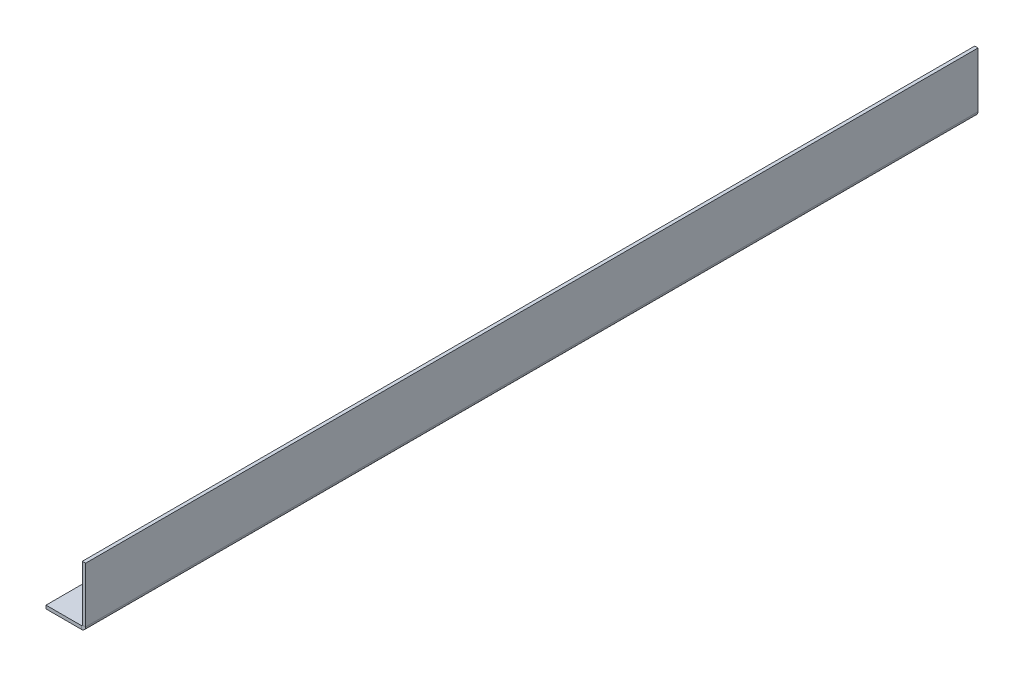
ISO-10303-21;
HEADER;
FILE_DESCRIPTION(('STEP AP214'),'2;1');
FILE_NAME('part.step','',(''),(''),'','','');
FILE_SCHEMA(('AUTOMOTIVE_DESIGN { 1 0 10303 214 1 1 1 1 }'));
ENDSEC;
DATA;
#1=APPLICATION_CONTEXT('core data for automotive mechanical design processes');
#2=APPLICATION_PROTOCOL_DEFINITION('international standard','automotive_design',2000,#1);
#3=PRODUCT_CONTEXT('',#1,'mechanical');
#4=PRODUCT('Part','Part','',(#3));
#5=PRODUCT_RELATED_PRODUCT_CATEGORY('part','',(#4));
#6=PRODUCT_DEFINITION_FORMATION('','',#4);
#7=PRODUCT_DEFINITION_CONTEXT('part definition',#1,'design');
#8=PRODUCT_DEFINITION('design','',#6,#7);
#9=PRODUCT_DEFINITION_SHAPE('','',#8);
#10=(LENGTH_UNIT() NAMED_UNIT(*) SI_UNIT(.MILLI.,.METRE.));
#11=(NAMED_UNIT(*) PLANE_ANGLE_UNIT() SI_UNIT($,.RADIAN.));
#12=(NAMED_UNIT(*) SI_UNIT($,.STERADIAN.) SOLID_ANGLE_UNIT());
#13=UNCERTAINTY_MEASURE_WITH_UNIT(LENGTH_MEASURE(1.E-05),#10,'distance_accuracy_value','');
#14=(GEOMETRIC_REPRESENTATION_CONTEXT(3) GLOBAL_UNCERTAINTY_ASSIGNED_CONTEXT((#13)) GLOBAL_UNIT_ASSIGNED_CONTEXT((#10,
#11,#12)) REPRESENTATION_CONTEXT('',''));
#15=CARTESIAN_POINT('',(0.,0.,0.));
#16=DIRECTION('',(0.,0.,1.));
#17=DIRECTION('',(1.,0.,0.));
#18=AXIS2_PLACEMENT_3D('',#15,#16,#17);
#19=CARTESIAN_POINT('',(-15.,9.99999999999995,-37.5));
#20=DIRECTION('',(0.,-1.,0.));
#21=DIRECTION('',(1.,0.,0.));
#22=AXIS2_PLACEMENT_3D('',#19,#20,#21);
#23=CYLINDRICAL_SURFACE('',#22,5.);
#24=CARTESIAN_POINT('',(-15.,0.,-37.5));
#25=DIRECTION('',(0.,-1.,0.));
#26=DIRECTION('',(1.,0.,0.));
#27=AXIS2_PLACEMENT_3D('',#24,#25,#26);
#28=CIRCLE('',#27,5.);
#29=CARTESIAN_POINT('',(-9.99999999999999,0.,-37.5));
#30=VERTEX_POINT('',#29);
#31=EDGE_CURVE('E77',#30,#30,#28,.T.);
#32=ORIENTED_EDGE('',*,*,#31,.T.);
#33=EDGE_LOOP('',(#32));
#34=FACE_BOUND('',#33,.T.);
#35=CARTESIAN_POINT('',(-15.,2.49999999999996,-37.5));
#36=DIRECTION('',(0.,-1.,0.));
#37=DIRECTION('',(1.,0.,0.));
#38=AXIS2_PLACEMENT_3D('',#35,#36,#37);
#39=CIRCLE('',#38,5.);
#40=CARTESIAN_POINT('',(-10.,2.49999999999998,-37.5));
#41=VERTEX_POINT('',#40);
#42=EDGE_CURVE('E15',#41,#41,#39,.T.);
#43=ORIENTED_EDGE('',*,*,#42,.F.);
#44=EDGE_LOOP('',(#43));
#45=FACE_BOUND('',#44,.T.);
#46=ADVANCED_FACE('F70',(#34,#45),#23,.F.);
#47=CARTESIAN_POINT('',(-15.,9.99999999999995,-237.5));
#48=DIRECTION('',(0.,-1.,0.));
#49=DIRECTION('',(1.,0.,0.));
#50=AXIS2_PLACEMENT_3D('',#47,#48,#49);
#51=CYLINDRICAL_SURFACE('',#50,5.);
#52=CARTESIAN_POINT('',(-15.,0.,-237.5));
#53=DIRECTION('',(0.,-1.,0.));
#54=DIRECTION('',(1.,0.,0.));
#55=AXIS2_PLACEMENT_3D('',#52,#53,#54);
#56=CIRCLE('',#55,5.);
#57=CARTESIAN_POINT('',(-9.99999999999999,0.,-237.5));
#58=VERTEX_POINT('',#57);
#59=EDGE_CURVE('E221',#58,#58,#56,.T.);
#60=ORIENTED_EDGE('',*,*,#59,.T.);
#61=EDGE_LOOP('',(#60));
#62=FACE_BOUND('',#61,.T.);
#63=CARTESIAN_POINT('',(-15.,2.49999999999996,-237.5));
#64=DIRECTION('',(0.,-1.,0.));
#65=DIRECTION('',(1.,0.,0.));
#66=AXIS2_PLACEMENT_3D('',#63,#64,#65);
#67=CIRCLE('',#66,5.);
#68=CARTESIAN_POINT('',(-10.,2.49999999999998,-237.5));
#69=VERTEX_POINT('',#68);
#70=EDGE_CURVE('E229',#69,#69,#67,.T.);
#71=ORIENTED_EDGE('',*,*,#70,.F.);
#72=EDGE_LOOP('',(#71));
#73=FACE_BOUND('',#72,.T.);
#74=ADVANCED_FACE('F254',(#62,#73),#51,.F.);
#75=CARTESIAN_POINT('',(-2.5,0.,0.));
#76=DIRECTION('',(0.,0.,1.));
#77=DIRECTION('',(1.,0.,0.));
#78=AXIS2_PLACEMENT_3D('',#75,#76,#77);
#79=PLANE('',#78);
#80=DIRECTION('',(0.,-1.,0.));
#81=VECTOR('',#80,1.);
#82=CARTESIAN_POINT('',(-2.5,0.,0.));
#83=LINE('',#82,#81);
#84=CARTESIAN_POINT('',(-2.5,45.,0.));
#85=VERTEX_POINT('',#84);
#86=CARTESIAN_POINT('',(-2.5,3.2366,0.));
#87=VERTEX_POINT('',#86);
#88=EDGE_CURVE('E204',#85,#87,#83,.T.);
#89=ORIENTED_EDGE('',*,*,#88,.T.);
#90=DIRECTION('',(1.,0.,0.));
#91=VECTOR('',#90,1.);
#92=CARTESIAN_POINT('',(-2.5,3.2366,0.));
#93=LINE('',#92,#91);
#94=CARTESIAN_POINT('',(0.,3.2366,0.));
#95=VERTEX_POINT('',#94);
#96=EDGE_CURVE('E195',#87,#95,#93,.T.);
#97=ORIENTED_EDGE('',*,*,#96,.T.);
#98=DIRECTION('',(0.,-1.,0.));
#99=VECTOR('',#98,1.);
#100=CARTESIAN_POINT('',(0.,0.,0.));
#101=LINE('',#100,#99);
#102=CARTESIAN_POINT('',(0.,45.,0.));
#103=VERTEX_POINT('',#102);
#104=EDGE_CURVE('E202',#103,#95,#101,.T.);
#105=ORIENTED_EDGE('',*,*,#104,.F.);
#106=DIRECTION('',(1.,0.,0.));
#107=VECTOR('',#106,1.);
#108=CARTESIAN_POINT('',(-2.5,45.,0.));
#109=LINE('',#108,#107);
#110=EDGE_CURVE('E219',#85,#103,#109,.T.);
#111=ORIENTED_EDGE('',*,*,#110,.F.);
#112=EDGE_LOOP('',(#89,#97,#105,#111));
#113=FACE_BOUND('',#112,.T.);
#114=ADVANCED_FACE('F258',(#113),#79,.T.);
#115=CARTESIAN_POINT('',(-2.5,0.,0.));
#116=DIRECTION('',(-1.,0.,0.));
#117=DIRECTION('',(0.,0.,1.));
#118=AXIS2_PLACEMENT_3D('',#115,#116,#117);
#119=PLANE('',#118);
#120=DIRECTION('',(0.,1.,0.));
#121=VECTOR('',#120,1.);
#122=CARTESIAN_POINT('',(-2.5,0.,-675.));
#123=LINE('',#122,#121);
#124=CARTESIAN_POINT('',(-2.5,3.2366,-675.));
#125=VERTEX_POINT('',#124);
#126=CARTESIAN_POINT('',(-2.5,45.,-675.));
#127=VERTEX_POINT('',#126);
#128=EDGE_CURVE('E206',#125,#127,#123,.T.);
#129=ORIENTED_EDGE('',*,*,#128,.F.);
#130=DIRECTION('',(0.,0.,1.));
#131=VECTOR('',#130,1.);
#132=CARTESIAN_POINT('',(-2.5,3.2366,0.));
#133=LINE('',#132,#131);
#134=EDGE_CURVE('E91',#87,#125,#133,.F.);
#135=ORIENTED_EDGE('',*,*,#134,.F.);
#136=ORIENTED_EDGE('',*,*,#88,.F.);
#137=DIRECTION('',(0.,0.,1.));
#138=VECTOR('',#137,1.);
#139=CARTESIAN_POINT('',(-2.5,45.,0.));
#140=LINE('',#139,#138);
#141=EDGE_CURVE('E209',#127,#85,#140,.T.);
#142=ORIENTED_EDGE('',*,*,#141,.F.);
#143=EDGE_LOOP('',(#129,#135,#136,#142));
#144=FACE_BOUND('',#143,.T.);
#145=ADVANCED_FACE('F263',(#144),#119,.T.);
#146=CARTESIAN_POINT('',(0.,0.,0.));
#147=DIRECTION('',(-1.,0.,0.));
#148=DIRECTION('',(0.,0.,1.));
#149=AXIS2_PLACEMENT_3D('',#146,#147,#148);
#150=PLANE('',#149);
#151=DIRECTION('',(0.,0.,1.));
#152=VECTOR('',#151,1.);
#153=CARTESIAN_POINT('',(0.,3.2366,0.));
#154=LINE('',#153,#152);
#155=CARTESIAN_POINT('',(0.,3.2366,-675.));
#156=VERTEX_POINT('',#155);
#157=EDGE_CURVE('E143',#95,#156,#154,.F.);
#158=ORIENTED_EDGE('',*,*,#157,.T.);
#159=DIRECTION('',(0.,1.,0.));
#160=VECTOR('',#159,1.);
#161=CARTESIAN_POINT('',(0.,0.,-675.));
#162=LINE('',#161,#160);
#163=CARTESIAN_POINT('',(0.,45.,-675.));
#164=VERTEX_POINT('',#163);
#165=EDGE_CURVE('E215',#156,#164,#162,.T.);
#166=ORIENTED_EDGE('',*,*,#165,.T.);
#167=DIRECTION('',(0.,0.,1.));
#168=VECTOR('',#167,1.);
#169=CARTESIAN_POINT('',(0.,45.,0.));
#170=LINE('',#169,#168);
#171=EDGE_CURVE('E207',#164,#103,#170,.T.);
#172=ORIENTED_EDGE('',*,*,#171,.T.);
#173=ORIENTED_EDGE('',*,*,#104,.T.);
#174=EDGE_LOOP('',(#158,#166,#172,#173));
#175=FACE_BOUND('',#174,.T.);
#176=ADVANCED_FACE('F275',(#175),#150,.F.);
#177=CARTESIAN_POINT('',(-2.5,45.,0.));
#178=DIRECTION('',(0.,1.,0.));
#179=DIRECTION('',(0.,0.,1.));
#180=AXIS2_PLACEMENT_3D('',#177,#178,#179);
#181=PLANE('',#180);
#182=ORIENTED_EDGE('',*,*,#171,.F.);
#183=DIRECTION('',(1.,0.,0.));
#184=VECTOR('',#183,1.);
#185=CARTESIAN_POINT('',(-2.5,45.,-675.));
#186=LINE('',#185,#184);
#187=EDGE_CURVE('E212',#127,#164,#186,.T.);
#188=ORIENTED_EDGE('',*,*,#187,.F.);
#189=ORIENTED_EDGE('',*,*,#141,.T.);
#190=ORIENTED_EDGE('',*,*,#110,.T.);
#191=EDGE_LOOP('',(#182,#188,#189,#190));
#192=FACE_BOUND('',#191,.T.);
#193=ADVANCED_FACE('F272',(#192),#181,.T.);
#194=CARTESIAN_POINT('',(-2.5,0.,-675.));
#195=DIRECTION('',(0.,0.,-1.));
#196=DIRECTION('',(-1.,0.,0.));
#197=AXIS2_PLACEMENT_3D('',#194,#195,#196);
#198=PLANE('',#197);
#199=DIRECTION('',(1.,0.,0.));
#200=VECTOR('',#199,1.);
#201=CARTESIAN_POINT('',(-2.5,3.2366,-675.));
#202=LINE('',#201,#200);
#203=EDGE_CURVE('E84',#125,#156,#202,.T.);
#204=ORIENTED_EDGE('',*,*,#203,.F.);
#205=ORIENTED_EDGE('',*,*,#128,.T.);
#206=ORIENTED_EDGE('',*,*,#187,.T.);
#207=ORIENTED_EDGE('',*,*,#165,.F.);
#208=EDGE_LOOP('',(#204,#205,#206,#207));
#209=FACE_BOUND('',#208,.T.);
#210=ADVANCED_FACE('F268',(#209),#198,.T.);
#211=CARTESIAN_POINT('',(-3.2366,3.2366,-675.));
#212=DIRECTION('',(0.,0.,-1.));
#213=DIRECTION('',(-1.,0.,0.));
#214=AXIS2_PLACEMENT_3D('',#211,#212,#213);
#215=PLANE('',#214);
#216=DIRECTION('',(0.,-1.,0.));
#217=VECTOR('',#216,1.);
#218=CARTESIAN_POINT('',(-3.23659999999999,0.,-675.));
#219=LINE('',#218,#217);
#220=CARTESIAN_POINT('',(-3.2366,2.5,-675.));
#221=VERTEX_POINT('',#220);
#222=CARTESIAN_POINT('',(-3.23659999999999,0.,-675.));
#223=VERTEX_POINT('',#222);
#224=EDGE_CURVE('E189',#221,#223,#219,.T.);
#225=ORIENTED_EDGE('',*,*,#224,.F.);
#226=CARTESIAN_POINT('',(-3.2366,3.2366,-675.));
#227=DIRECTION('',(0.,0.,1.));
#228=DIRECTION('',(1.,0.,0.));
#229=AXIS2_PLACEMENT_3D('',#226,#227,#228);
#230=CIRCLE('',#229,0.7366);
#231=EDGE_CURVE('E146',#125,#221,#230,.F.);
#232=ORIENTED_EDGE('',*,*,#231,.F.);
#233=ORIENTED_EDGE('',*,*,#203,.T.);
#234=CARTESIAN_POINT('',(-3.2366,3.2366,-675.));
#235=DIRECTION('',(0.,0.,1.));
#236=DIRECTION('',(1.,0.,0.));
#237=AXIS2_PLACEMENT_3D('',#234,#235,#236);
#238=CIRCLE('',#237,3.2366);
#239=EDGE_CURVE('E194',#156,#223,#238,.F.);
#240=ORIENTED_EDGE('',*,*,#239,.T.);
#241=EDGE_LOOP('',(#225,#232,#233,#240));
#242=FACE_BOUND('',#241,.T.);
#243=ADVANCED_FACE('F271',(#242),#215,.T.);
#244=CARTESIAN_POINT('',(-3.2366,3.2366,0.));
#245=DIRECTION('',(0.,0.,-1.));
#246=DIRECTION('',(-1.,0.,0.));
#247=AXIS2_PLACEMENT_3D('',#244,#245,#246);
#248=PLANE('',#247);
#249=CARTESIAN_POINT('',(-3.2366,3.2366,0.));
#250=DIRECTION('',(0.,0.,1.));
#251=DIRECTION('',(1.,0.,0.));
#252=AXIS2_PLACEMENT_3D('',#249,#250,#251);
#253=CIRCLE('',#252,0.7366);
#254=CARTESIAN_POINT('',(-3.2366,2.5,0.));
#255=VERTEX_POINT('',#254);
#256=EDGE_CURVE('E153',#255,#87,#253,.T.);
#257=ORIENTED_EDGE('',*,*,#256,.F.);
#258=DIRECTION('',(0.,-1.,0.));
#259=VECTOR('',#258,1.);
#260=CARTESIAN_POINT('',(-3.2366,2.5,0.));
#261=LINE('',#260,#259);
#262=CARTESIAN_POINT('',(-3.23659999999999,0.,0.));
#263=VERTEX_POINT('',#262);
#264=EDGE_CURVE('E150',#255,#263,#261,.T.);
#265=ORIENTED_EDGE('',*,*,#264,.T.);
#266=CARTESIAN_POINT('',(-3.2366,3.2366,0.));
#267=DIRECTION('',(0.,0.,1.));
#268=DIRECTION('',(1.,0.,0.));
#269=AXIS2_PLACEMENT_3D('',#266,#267,#268);
#270=CIRCLE('',#269,3.2366);
#271=EDGE_CURVE('E136',#263,#95,#270,.T.);
#272=ORIENTED_EDGE('',*,*,#271,.T.);
#273=ORIENTED_EDGE('',*,*,#96,.F.);
#274=EDGE_LOOP('',(#257,#265,#272,#273));
#275=FACE_BOUND('',#274,.T.);
#276=ADVANCED_FACE('F151',(#275),#248,.F.);
#277=CARTESIAN_POINT('',(-3.2366,3.2366,0.));
#278=DIRECTION('',(0.,0.,1.));
#279=DIRECTION('',(0.,-1.,0.));
#280=AXIS2_PLACEMENT_3D('',#277,#278,#279);
#281=CYLINDRICAL_SURFACE('',#280,3.2366);
#282=ORIENTED_EDGE('',*,*,#157,.F.);
#283=ORIENTED_EDGE('',*,*,#271,.F.);
#284=DIRECTION('',(0.,0.,1.));
#285=VECTOR('',#284,1.);
#286=CARTESIAN_POINT('',(-3.23659999999999,0.,0.));
#287=LINE('',#286,#285);
#288=EDGE_CURVE('E141',#223,#263,#287,.T.);
#289=ORIENTED_EDGE('',*,*,#288,.F.);
#290=ORIENTED_EDGE('',*,*,#239,.F.);
#291=EDGE_LOOP('',(#282,#283,#289,#290));
#292=FACE_BOUND('',#291,.T.);
#293=ADVANCED_FACE('F138',(#292),#281,.T.);
#294=CARTESIAN_POINT('',(-3.2366,3.2366,0.));
#295=DIRECTION('',(0.,0.,1.));
#296=DIRECTION('',(0.,-1.,0.));
#297=AXIS2_PLACEMENT_3D('',#294,#295,#296);
#298=CYLINDRICAL_SURFACE('',#297,0.7366);
#299=ORIENTED_EDGE('',*,*,#134,.T.);
#300=ORIENTED_EDGE('',*,*,#231,.T.);
#301=DIRECTION('',(0.,0.,-1.));
#302=VECTOR('',#301,1.);
#303=CARTESIAN_POINT('',(-3.2366,2.5,-675.));
#304=LINE('',#303,#302);
#305=EDGE_CURVE('E158',#221,#255,#304,.F.);
#306=ORIENTED_EDGE('',*,*,#305,.T.);
#307=ORIENTED_EDGE('',*,*,#256,.T.);
#308=EDGE_LOOP('',(#299,#300,#306,#307));
#309=FACE_BOUND('',#308,.T.);
#310=ADVANCED_FACE('F287',(#309),#298,.F.);
#311=CARTESIAN_POINT('',(-2.49999999999999,0.,0.));
#312=DIRECTION('',(0.,0.,1.));
#313=DIRECTION('',(1.,0.,0.));
#314=AXIS2_PLACEMENT_3D('',#311,#312,#313);
#315=PLANE('',#314);
#316=DIRECTION('',(1.,0.,0.));
#317=VECTOR('',#316,1.);
#318=CARTESIAN_POINT('',(-2.49999999999999,0.,0.));
#319=LINE('',#318,#317);
#320=CARTESIAN_POINT('',(-30.,0.,0.));
#321=VERTEX_POINT('',#320);
#322=EDGE_CURVE('E166',#321,#263,#319,.T.);
#323=ORIENTED_EDGE('',*,*,#322,.T.);
#324=ORIENTED_EDGE('',*,*,#264,.F.);
#325=DIRECTION('',(-1.,0.,0.));
#326=VECTOR('',#325,1.);
#327=CARTESIAN_POINT('',(0.,2.50000000000001,0.));
#328=LINE('',#327,#326);
#329=CARTESIAN_POINT('',(-30.,2.4999999999999,0.));
#330=VERTEX_POINT('',#329);
#331=EDGE_CURVE('E182',#330,#255,#328,.F.);
#332=ORIENTED_EDGE('',*,*,#331,.F.);
#333=DIRECTION('',(0.,1.,0.));
#334=VECTOR('',#333,1.);
#335=CARTESIAN_POINT('',(-30.,0.,0.));
#336=LINE('',#335,#334);
#337=EDGE_CURVE('E171',#321,#330,#336,.T.);
#338=ORIENTED_EDGE('',*,*,#337,.F.);
#339=EDGE_LOOP('',(#323,#324,#332,#338));
#340=FACE_BOUND('',#339,.T.);
#341=ADVANCED_FACE('F170',(#340),#315,.T.);
#342=CARTESIAN_POINT('',(-30.,0.,-675.));
#343=DIRECTION('',(0.,0.,-1.));
#344=DIRECTION('',(-1.,0.,0.));
#345=AXIS2_PLACEMENT_3D('',#342,#343,#344);
#346=PLANE('',#345);
#347=DIRECTION('',(1.,0.,0.));
#348=VECTOR('',#347,1.);
#349=CARTESIAN_POINT('',(0.,2.50000000000001,-675.));
#350=LINE('',#349,#348);
#351=CARTESIAN_POINT('',(-30.,2.4999999999999,-675.));
#352=VERTEX_POINT('',#351);
#353=EDGE_CURVE('E168',#221,#352,#350,.F.);
#354=ORIENTED_EDGE('',*,*,#353,.F.);
#355=ORIENTED_EDGE('',*,*,#224,.T.);
#356=DIRECTION('',(-1.,0.,0.));
#357=VECTOR('',#356,1.);
#358=CARTESIAN_POINT('',(-30.,0.,-675.));
#359=LINE('',#358,#357);
#360=CARTESIAN_POINT('',(-30.,0.,-675.));
#361=VERTEX_POINT('',#360);
#362=EDGE_CURVE('E167',#223,#361,#359,.T.);
#363=ORIENTED_EDGE('',*,*,#362,.T.);
#364=DIRECTION('',(0.,1.,0.));
#365=VECTOR('',#364,1.);
#366=CARTESIAN_POINT('',(-30.,0.,-675.));
#367=LINE('',#366,#365);
#368=EDGE_CURVE('E173',#361,#352,#367,.T.);
#369=ORIENTED_EDGE('',*,*,#368,.T.);
#370=EDGE_LOOP('',(#354,#355,#363,#369));
#371=FACE_BOUND('',#370,.T.);
#372=ADVANCED_FACE('F238',(#371),#346,.T.);
#373=CARTESIAN_POINT('',(0.,0.,0.));
#374=DIRECTION('',(0.,-1.,0.));
#375=DIRECTION('',(1.,0.,0.));
#376=AXIS2_PLACEMENT_3D('',#373,#374,#375);
#377=PLANE('',#376);
#378=CARTESIAN_POINT('',(-15.,0.,-437.5));
#379=DIRECTION('',(0.,-1.,0.));
#380=DIRECTION('',(1.,0.,0.));
#381=AXIS2_PLACEMENT_3D('',#378,#379,#380);
#382=CIRCLE('',#381,5.);
#383=CARTESIAN_POINT('',(-9.99999999999999,0.,-437.5));
#384=VERTEX_POINT('',#383);
#385=EDGE_CURVE('E444',#384,#384,#382,.T.);
#386=ORIENTED_EDGE('',*,*,#385,.F.);
#387=EDGE_LOOP('',(#386));
#388=FACE_BOUND('',#387,.T.);
#389=CARTESIAN_POINT('',(-15.,0.,-637.5));
#390=DIRECTION('',(0.,-1.,0.));
#391=DIRECTION('',(1.,0.,0.));
#392=AXIS2_PLACEMENT_3D('',#389,#390,#391);
#393=CIRCLE('',#392,5.);
#394=CARTESIAN_POINT('',(-9.99999999999999,0.,-637.5));
#395=VERTEX_POINT('',#394);
#396=EDGE_CURVE('E226',#395,#395,#393,.T.);
#397=ORIENTED_EDGE('',*,*,#396,.F.);
#398=EDGE_LOOP('',(#397));
#399=FACE_BOUND('',#398,.T.);
#400=ORIENTED_EDGE('',*,*,#362,.F.);
#401=ORIENTED_EDGE('',*,*,#288,.T.);
#402=ORIENTED_EDGE('',*,*,#322,.F.);
#403=DIRECTION('',(0.,0.,1.));
#404=VECTOR('',#403,1.);
#405=CARTESIAN_POINT('',(-30.,0.,0.));
#406=LINE('',#405,#404);
#407=EDGE_CURVE('E174',#361,#321,#406,.T.);
#408=ORIENTED_EDGE('',*,*,#407,.F.);
#409=EDGE_LOOP('',(#400,#401,#402,#408));
#410=FACE_BOUND('',#409,.T.);
#411=ORIENTED_EDGE('',*,*,#59,.F.);
#412=EDGE_LOOP('',(#411));
#413=FACE_BOUND('',#412,.T.);
#414=ORIENTED_EDGE('',*,*,#31,.F.);
#415=EDGE_LOOP('',(#414));
#416=FACE_BOUND('',#415,.T.);
#417=ADVANCED_FACE('F163',(#388,#399,#410,#413,#416),#377,.T.);
#418=CARTESIAN_POINT('',(0.,2.50000000000001,0.));
#419=DIRECTION('',(0.,-1.,0.));
#420=DIRECTION('',(1.,0.,0.));
#421=AXIS2_PLACEMENT_3D('',#418,#419,#420);
#422=PLANE('',#421);
#423=CARTESIAN_POINT('',(-15.,2.49999999999996,-437.5));
#424=DIRECTION('',(0.,-1.,0.));
#425=DIRECTION('',(1.,0.,0.));
#426=AXIS2_PLACEMENT_3D('',#423,#424,#425);
#427=CIRCLE('',#426,5.);
#428=CARTESIAN_POINT('',(-10.,2.49999999999997,-437.5));
#429=VERTEX_POINT('',#428);
#430=EDGE_CURVE('E447',#429,#429,#427,.T.);
#431=ORIENTED_EDGE('',*,*,#430,.T.);
#432=EDGE_LOOP('',(#431));
#433=FACE_BOUND('',#432,.T.);
#434=CARTESIAN_POINT('',(-15.,2.49999999999996,-637.5));
#435=DIRECTION('',(0.,-1.,0.));
#436=DIRECTION('',(1.,0.,0.));
#437=AXIS2_PLACEMENT_3D('',#434,#435,#436);
#438=CIRCLE('',#437,5.);
#439=CARTESIAN_POINT('',(-10.,2.49999999999997,-637.5));
#440=VERTEX_POINT('',#439);
#441=EDGE_CURVE('E192',#440,#440,#438,.T.);
#442=ORIENTED_EDGE('',*,*,#441,.T.);
#443=EDGE_LOOP('',(#442));
#444=FACE_BOUND('',#443,.T.);
#445=ORIENTED_EDGE('',*,*,#305,.F.);
#446=ORIENTED_EDGE('',*,*,#353,.T.);
#447=DIRECTION('',(0.,0.,-1.));
#448=VECTOR('',#447,1.);
#449=CARTESIAN_POINT('',(-30.,2.4999999999999,0.));
#450=LINE('',#449,#448);
#451=EDGE_CURVE('E184',#352,#330,#450,.F.);
#452=ORIENTED_EDGE('',*,*,#451,.T.);
#453=ORIENTED_EDGE('',*,*,#331,.T.);
#454=EDGE_LOOP('',(#445,#446,#452,#453));
#455=FACE_BOUND('',#454,.T.);
#456=ORIENTED_EDGE('',*,*,#70,.T.);
#457=EDGE_LOOP('',(#456));
#458=FACE_BOUND('',#457,.T.);
#459=ORIENTED_EDGE('',*,*,#42,.T.);
#460=EDGE_LOOP('',(#459));
#461=FACE_BOUND('',#460,.T.);
#462=ADVANCED_FACE('F237',(#433,#444,#455,#458,#461),#422,.F.);
#463=CARTESIAN_POINT('',(-30.,0.,0.));
#464=DIRECTION('',(-1.,0.,0.));
#465=DIRECTION('',(0.,-1.,0.));
#466=AXIS2_PLACEMENT_3D('',#463,#464,#465);
#467=PLANE('',#466);
#468=ORIENTED_EDGE('',*,*,#451,.F.);
#469=ORIENTED_EDGE('',*,*,#368,.F.);
#470=ORIENTED_EDGE('',*,*,#407,.T.);
#471=ORIENTED_EDGE('',*,*,#337,.T.);
#472=EDGE_LOOP('',(#468,#469,#470,#471));
#473=FACE_BOUND('',#472,.T.);
#474=ADVANCED_FACE('F245',(#473),#467,.T.);
#475=CARTESIAN_POINT('',(-15.,9.99999999999995,-637.5));
#476=DIRECTION('',(0.,-1.,0.));
#477=DIRECTION('',(1.,0.,0.));
#478=AXIS2_PLACEMENT_3D('',#475,#476,#477);
#479=CYLINDRICAL_SURFACE('',#478,5.);
#480=ORIENTED_EDGE('',*,*,#396,.T.);
#481=EDGE_LOOP('',(#480));
#482=FACE_BOUND('',#481,.T.);
#483=ORIENTED_EDGE('',*,*,#441,.F.);
#484=EDGE_LOOP('',(#483));
#485=FACE_BOUND('',#484,.T.);
#486=ADVANCED_FACE('F295',(#482,#485),#479,.F.);
#487=CARTESIAN_POINT('',(-15.,9.99999999999995,-437.5));
#488=DIRECTION('',(0.,-1.,0.));
#489=DIRECTION('',(1.,0.,0.));
#490=AXIS2_PLACEMENT_3D('',#487,#488,#489);
#491=CYLINDRICAL_SURFACE('',#490,5.);
#492=ORIENTED_EDGE('',*,*,#385,.T.);
#493=EDGE_LOOP('',(#492));
#494=FACE_BOUND('',#493,.T.);
#495=ORIENTED_EDGE('',*,*,#430,.F.);
#496=EDGE_LOOP('',(#495));
#497=FACE_BOUND('',#496,.T.);
#498=ADVANCED_FACE('F324',(#494,#497),#491,.F.);
#499=CLOSED_SHELL('',(#46,#74,#114,#145,#176,#193,#210,#243,#276,#293,#310,#341,#372,#417,#462,
#474,#486,#498));
#500=MANIFOLD_SOLID_BREP('B2',#499);
#501=ADVANCED_BREP_SHAPE_REPRESENTATION('',(#18,#500),#14);
#502=SHAPE_DEFINITION_REPRESENTATION(#9,#501);
ENDSEC;
END-ISO-10303-21;
